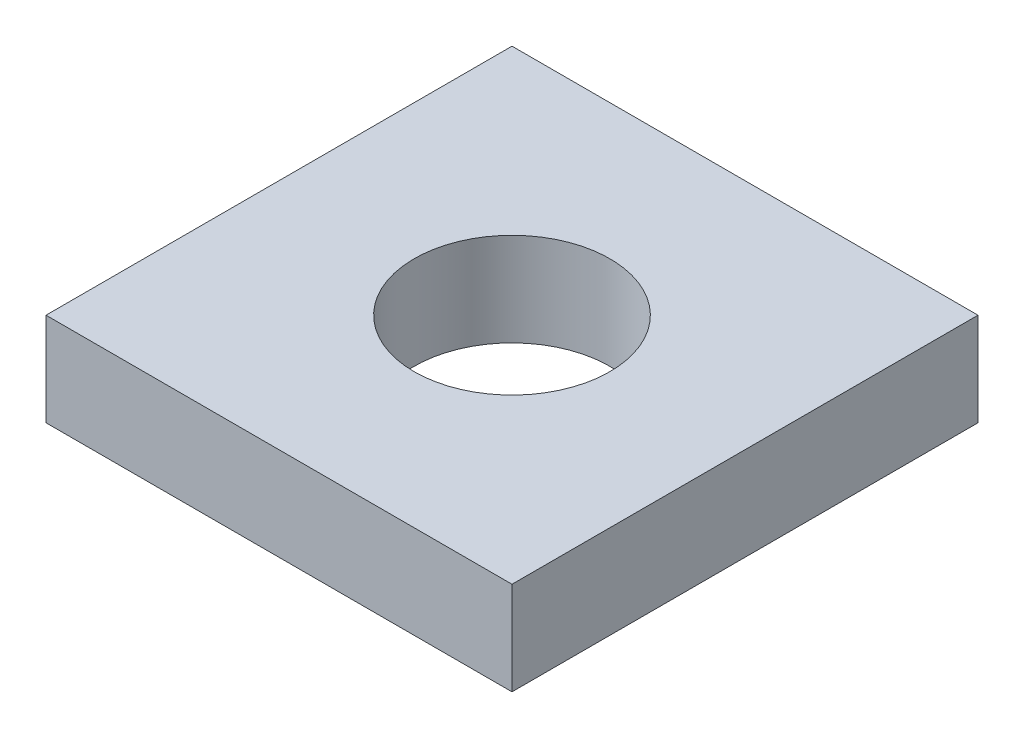
ISO-10303-21;
HEADER;
FILE_DESCRIPTION(('STEP AP214'),'2;1');
FILE_NAME('part.step','',(''),(''),'','','');
FILE_SCHEMA(('AUTOMOTIVE_DESIGN { 1 0 10303 214 1 1 1 1 }'));
ENDSEC;
DATA;
#1=APPLICATION_CONTEXT('core data for automotive mechanical design processes');
#2=APPLICATION_PROTOCOL_DEFINITION('international standard','automotive_design',2000,#1);
#3=PRODUCT_CONTEXT('',#1,'mechanical');
#4=PRODUCT('Part','Part','',(#3));
#5=PRODUCT_RELATED_PRODUCT_CATEGORY('part','',(#4));
#6=PRODUCT_DEFINITION_FORMATION('','',#4);
#7=PRODUCT_DEFINITION_CONTEXT('part definition',#1,'design');
#8=PRODUCT_DEFINITION('design','',#6,#7);
#9=PRODUCT_DEFINITION_SHAPE('','',#8);
#10=(LENGTH_UNIT() NAMED_UNIT(*) SI_UNIT(.MILLI.,.METRE.));
#11=(NAMED_UNIT(*) PLANE_ANGLE_UNIT() SI_UNIT($,.RADIAN.));
#12=(NAMED_UNIT(*) SI_UNIT($,.STERADIAN.) SOLID_ANGLE_UNIT());
#13=UNCERTAINTY_MEASURE_WITH_UNIT(LENGTH_MEASURE(1.E-05),#10,'distance_accuracy_value','');
#14=(GEOMETRIC_REPRESENTATION_CONTEXT(3) GLOBAL_UNCERTAINTY_ASSIGNED_CONTEXT((#13)) GLOBAL_UNIT_ASSIGNED_CONTEXT((#10,
#11,#12)) REPRESENTATION_CONTEXT('',''));
#15=CARTESIAN_POINT('',(0.,0.,0.));
#16=DIRECTION('',(0.,0.,1.));
#17=DIRECTION('',(1.,0.,0.));
#18=AXIS2_PLACEMENT_3D('',#15,#16,#17);
#19=CARTESIAN_POINT('',(0.,2.,0.));
#20=DIRECTION('',(0.,-1.,0.));
#21=DIRECTION('',(0.,0.,-1.));
#22=AXIS2_PLACEMENT_3D('',#19,#20,#21);
#23=PLANE('',#22);
#24=DIRECTION('',(0.,0.,1.));
#25=VECTOR('',#24,1.);
#26=CARTESIAN_POINT('',(0.,2.,0.));
#27=LINE('',#26,#25);
#28=CARTESIAN_POINT('',(0.,2.,-10.));
#29=VERTEX_POINT('',#28);
#30=CARTESIAN_POINT('',(0.,2.,0.));
#31=VERTEX_POINT('',#30);
#32=EDGE_CURVE('E91',#29,#31,#27,.T.);
#33=ORIENTED_EDGE('',*,*,#32,.T.);
#34=DIRECTION('',(1.,0.,0.));
#35=VECTOR('',#34,1.);
#36=CARTESIAN_POINT('',(0.,2.,0.));
#37=LINE('',#36,#35);
#38=CARTESIAN_POINT('',(10.,2.,0.));
#39=VERTEX_POINT('',#38);
#40=EDGE_CURVE('E86',#31,#39,#37,.T.);
#41=ORIENTED_EDGE('',*,*,#40,.T.);
#42=DIRECTION('',(0.,0.,-1.));
#43=VECTOR('',#42,1.);
#44=CARTESIAN_POINT('',(10.,2.,0.));
#45=LINE('',#44,#43);
#46=CARTESIAN_POINT('',(10.,2.,-10.));
#47=VERTEX_POINT('',#46);
#48=EDGE_CURVE('E89',#39,#47,#45,.T.);
#49=ORIENTED_EDGE('',*,*,#48,.T.);
#50=DIRECTION('',(-1.,0.,0.));
#51=VECTOR('',#50,1.);
#52=CARTESIAN_POINT('',(0.,2.,-10.));
#53=LINE('',#52,#51);
#54=EDGE_CURVE('E56',#47,#29,#53,.T.);
#55=ORIENTED_EDGE('',*,*,#54,.T.);
#56=EDGE_LOOP('',(#33,#41,#49,#55));
#57=FACE_BOUND('',#56,.T.);
#58=CARTESIAN_POINT('',(5.,2.,-5.));
#59=DIRECTION('',(0.,1.,0.));
#60=DIRECTION('',(0.,0.,1.));
#61=AXIS2_PLACEMENT_3D('',#58,#59,#60);
#62=CIRCLE('',#61,2.1);
#63=CARTESIAN_POINT('',(5.,2.,-2.9));
#64=VERTEX_POINT('',#63);
#65=EDGE_CURVE('E106',#64,#64,#62,.T.);
#66=ORIENTED_EDGE('',*,*,#65,.F.);
#67=EDGE_LOOP('',(#66));
#68=FACE_BOUND('',#67,.T.);
#69=ADVANCED_FACE('F39',(#57,#68),#23,.F.);
#70=CARTESIAN_POINT('',(0.,0.,0.));
#71=DIRECTION('',(0.,-1.,0.));
#72=DIRECTION('',(0.,0.,-1.));
#73=AXIS2_PLACEMENT_3D('',#70,#71,#72);
#74=PLANE('',#73);
#75=DIRECTION('',(0.,0.,1.));
#76=VECTOR('',#75,1.);
#77=CARTESIAN_POINT('',(0.,0.,0.));
#78=LINE('',#77,#76);
#79=CARTESIAN_POINT('',(0.,0.,-10.));
#80=VERTEX_POINT('',#79);
#81=CARTESIAN_POINT('',(0.,0.,0.));
#82=VERTEX_POINT('',#81);
#83=EDGE_CURVE('E103',#80,#82,#78,.T.);
#84=ORIENTED_EDGE('',*,*,#83,.F.);
#85=DIRECTION('',(-1.,0.,0.));
#86=VECTOR('',#85,1.);
#87=CARTESIAN_POINT('',(0.,0.,-10.));
#88=LINE('',#87,#86);
#89=CARTESIAN_POINT('',(10.,0.,-10.));
#90=VERTEX_POINT('',#89);
#91=EDGE_CURVE('E79',#90,#80,#88,.T.);
#92=ORIENTED_EDGE('',*,*,#91,.F.);
#93=DIRECTION('',(0.,0.,-1.));
#94=VECTOR('',#93,1.);
#95=CARTESIAN_POINT('',(10.,0.,0.));
#96=LINE('',#95,#94);
#97=CARTESIAN_POINT('',(10.,0.,0.));
#98=VERTEX_POINT('',#97);
#99=EDGE_CURVE('E73',#98,#90,#96,.T.);
#100=ORIENTED_EDGE('',*,*,#99,.F.);
#101=DIRECTION('',(1.,0.,0.));
#102=VECTOR('',#101,1.);
#103=CARTESIAN_POINT('',(0.,0.,0.));
#104=LINE('',#103,#102);
#105=EDGE_CURVE('E95',#82,#98,#104,.T.);
#106=ORIENTED_EDGE('',*,*,#105,.F.);
#107=EDGE_LOOP('',(#84,#92,#100,#106));
#108=FACE_BOUND('',#107,.T.);
#109=CARTESIAN_POINT('',(5.,0.,-5.));
#110=DIRECTION('',(0.,1.,0.));
#111=DIRECTION('',(0.,0.,1.));
#112=AXIS2_PLACEMENT_3D('',#109,#110,#111);
#113=CIRCLE('',#112,2.1);
#114=CARTESIAN_POINT('',(5.,0.,-2.9));
#115=VERTEX_POINT('',#114);
#116=EDGE_CURVE('E118',#115,#115,#113,.T.);
#117=ORIENTED_EDGE('',*,*,#116,.T.);
#118=EDGE_LOOP('',(#117));
#119=FACE_BOUND('',#118,.T.);
#120=ADVANCED_FACE('F114',(#108,#119),#74,.T.);
#121=CARTESIAN_POINT('',(0.,2.,0.));
#122=DIRECTION('',(1.,0.,0.));
#123=DIRECTION('',(0.,0.,-1.));
#124=AXIS2_PLACEMENT_3D('',#121,#122,#123);
#125=PLANE('',#124);
#126=ORIENTED_EDGE('',*,*,#83,.T.);
#127=DIRECTION('',(0.,-1.,0.));
#128=VECTOR('',#127,1.);
#129=CARTESIAN_POINT('',(0.,2.,0.));
#130=LINE('',#129,#128);
#131=EDGE_CURVE('E11',#31,#82,#130,.T.);
#132=ORIENTED_EDGE('',*,*,#131,.F.);
#133=ORIENTED_EDGE('',*,*,#32,.F.);
#134=DIRECTION('',(0.,-1.,0.));
#135=VECTOR('',#134,1.);
#136=CARTESIAN_POINT('',(0.,2.,-10.));
#137=LINE('',#136,#135);
#138=EDGE_CURVE('E99',#29,#80,#137,.T.);
#139=ORIENTED_EDGE('',*,*,#138,.T.);
#140=EDGE_LOOP('',(#126,#132,#133,#139));
#141=FACE_BOUND('',#140,.T.);
#142=ADVANCED_FACE('F41',(#141),#125,.F.);
#143=CARTESIAN_POINT('',(0.,2.,0.));
#144=DIRECTION('',(0.,0.,-1.));
#145=DIRECTION('',(-1.,0.,0.));
#146=AXIS2_PLACEMENT_3D('',#143,#144,#145);
#147=PLANE('',#146);
#148=ORIENTED_EDGE('',*,*,#105,.T.);
#149=DIRECTION('',(0.,-1.,0.));
#150=VECTOR('',#149,1.);
#151=CARTESIAN_POINT('',(10.,2.,0.));
#152=LINE('',#151,#150);
#153=EDGE_CURVE('E48',#39,#98,#152,.T.);
#154=ORIENTED_EDGE('',*,*,#153,.F.);
#155=ORIENTED_EDGE('',*,*,#40,.F.);
#156=ORIENTED_EDGE('',*,*,#131,.T.);
#157=EDGE_LOOP('',(#148,#154,#155,#156));
#158=FACE_BOUND('',#157,.T.);
#159=ADVANCED_FACE('F94',(#158),#147,.F.);
#160=CARTESIAN_POINT('',(10.,2.,0.));
#161=DIRECTION('',(-1.,0.,0.));
#162=DIRECTION('',(0.,0.,1.));
#163=AXIS2_PLACEMENT_3D('',#160,#161,#162);
#164=PLANE('',#163);
#165=ORIENTED_EDGE('',*,*,#99,.T.);
#166=DIRECTION('',(0.,-1.,0.));
#167=VECTOR('',#166,1.);
#168=CARTESIAN_POINT('',(10.,2.,-10.));
#169=LINE('',#168,#167);
#170=EDGE_CURVE('E96',#47,#90,#169,.T.);
#171=ORIENTED_EDGE('',*,*,#170,.F.);
#172=ORIENTED_EDGE('',*,*,#48,.F.);
#173=ORIENTED_EDGE('',*,*,#153,.T.);
#174=EDGE_LOOP('',(#165,#171,#172,#173));
#175=FACE_BOUND('',#174,.T.);
#176=ADVANCED_FACE('F97',(#175),#164,.F.);
#177=CARTESIAN_POINT('',(0.,2.,-10.));
#178=DIRECTION('',(0.,0.,1.));
#179=DIRECTION('',(1.,0.,0.));
#180=AXIS2_PLACEMENT_3D('',#177,#178,#179);
#181=PLANE('',#180);
#182=ORIENTED_EDGE('',*,*,#91,.T.);
#183=ORIENTED_EDGE('',*,*,#138,.F.);
#184=ORIENTED_EDGE('',*,*,#54,.F.);
#185=ORIENTED_EDGE('',*,*,#170,.T.);
#186=EDGE_LOOP('',(#182,#183,#184,#185));
#187=FACE_BOUND('',#186,.T.);
#188=ADVANCED_FACE('F111',(#187),#181,.F.);
#189=CARTESIAN_POINT('',(5.,2.,-5.));
#190=DIRECTION('',(0.,-1.,0.));
#191=DIRECTION('',(0.,0.,-1.));
#192=AXIS2_PLACEMENT_3D('',#189,#190,#191);
#193=CYLINDRICAL_SURFACE('',#192,2.1);
#194=ORIENTED_EDGE('',*,*,#65,.T.);
#195=EDGE_LOOP('',(#194));
#196=FACE_BOUND('',#195,.T.);
#197=ORIENTED_EDGE('',*,*,#116,.F.);
#198=EDGE_LOOP('',(#197));
#199=FACE_BOUND('',#198,.T.);
#200=ADVANCED_FACE('F124',(#196,#199),#193,.F.);
#201=CLOSED_SHELL('',(#69,#120,#142,#159,#176,#188,#200));
#202=MANIFOLD_SOLID_BREP('B2',#201);
#203=ADVANCED_BREP_SHAPE_REPRESENTATION('',(#18,#202),#14);
#204=SHAPE_DEFINITION_REPRESENTATION(#9,#203);
ENDSEC;
END-ISO-10303-21;
